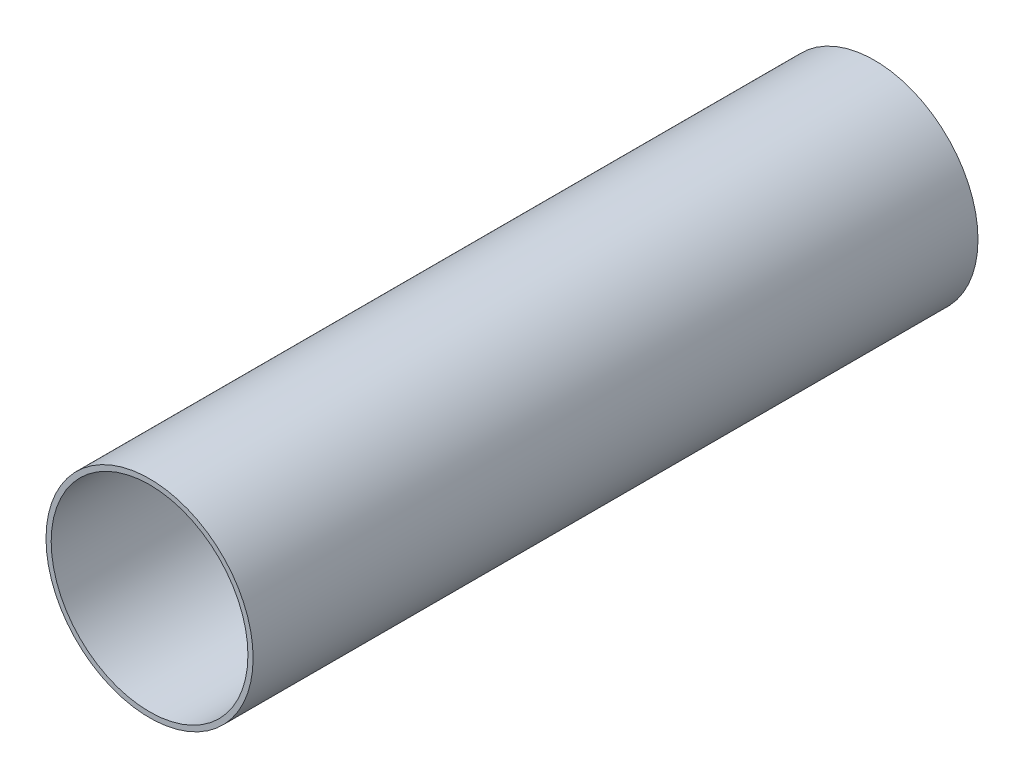
ISO-10303-21;
HEADER;
FILE_DESCRIPTION(('STEP AP214'),'2;1');
FILE_NAME('part.step','',(''),(''),'','','');
FILE_SCHEMA(('AUTOMOTIVE_DESIGN { 1 0 10303 214 1 1 1 1 }'));
ENDSEC;
DATA;
#1=APPLICATION_CONTEXT('core data for automotive mechanical design processes');
#2=APPLICATION_PROTOCOL_DEFINITION('international standard','automotive_design',2000,#1);
#3=PRODUCT_CONTEXT('',#1,'mechanical');
#4=PRODUCT('Part','Part','',(#3));
#5=PRODUCT_RELATED_PRODUCT_CATEGORY('part','',(#4));
#6=PRODUCT_DEFINITION_FORMATION('','',#4);
#7=PRODUCT_DEFINITION_CONTEXT('part definition',#1,'design');
#8=PRODUCT_DEFINITION('design','',#6,#7);
#9=PRODUCT_DEFINITION_SHAPE('','',#8);
#10=(LENGTH_UNIT() NAMED_UNIT(*) SI_UNIT(.MILLI.,.METRE.));
#11=(NAMED_UNIT(*) PLANE_ANGLE_UNIT() SI_UNIT($,.RADIAN.));
#12=(NAMED_UNIT(*) SI_UNIT($,.STERADIAN.) SOLID_ANGLE_UNIT());
#13=UNCERTAINTY_MEASURE_WITH_UNIT(LENGTH_MEASURE(1.E-05),#10,'distance_accuracy_value','');
#14=(GEOMETRIC_REPRESENTATION_CONTEXT(3) GLOBAL_UNCERTAINTY_ASSIGNED_CONTEXT((#13)) GLOBAL_UNIT_ASSIGNED_CONTEXT((#10,
#11,#12)) REPRESENTATION_CONTEXT('',''));
#15=CARTESIAN_POINT('',(0.,0.,0.));
#16=DIRECTION('',(0.,0.,1.));
#17=DIRECTION('',(1.,0.,0.));
#18=AXIS2_PLACEMENT_3D('',#15,#16,#17);
#19=CARTESIAN_POINT('',(0.,0.,70.));
#20=DIRECTION('',(0.,0.,1.));
#21=DIRECTION('',(1.,0.,0.));
#22=AXIS2_PLACEMENT_3D('',#19,#20,#21);
#23=PLANE('',#22);
#24=CARTESIAN_POINT('',(0.,0.,70.));
#25=DIRECTION('',(0.,0.,1.));
#26=DIRECTION('',(1.,0.,0.));
#27=AXIS2_PLACEMENT_3D('',#24,#25,#26);
#28=CIRCLE('',#27,10.);
#29=CARTESIAN_POINT('',(10.,0.,70.));
#30=VERTEX_POINT('',#29);
#31=EDGE_CURVE('E10',#30,#30,#28,.T.);
#32=ORIENTED_EDGE('',*,*,#31,.T.);
#33=EDGE_LOOP('',(#32));
#34=FACE_BOUND('',#33,.T.);
#35=CARTESIAN_POINT('',(0.,0.,70.));
#36=DIRECTION('',(0.,0.,1.));
#37=DIRECTION('',(1.,0.,0.));
#38=AXIS2_PLACEMENT_3D('',#35,#36,#37);
#39=CIRCLE('',#38,9.5);
#40=CARTESIAN_POINT('',(9.5,0.,70.));
#41=VERTEX_POINT('',#40);
#42=EDGE_CURVE('E42',#41,#41,#39,.T.);
#43=ORIENTED_EDGE('',*,*,#42,.F.);
#44=EDGE_LOOP('',(#43));
#45=FACE_BOUND('',#44,.T.);
#46=ADVANCED_FACE('F31',(#34,#45),#23,.T.);
#47=CARTESIAN_POINT('',(0.,0.,0.));
#48=DIRECTION('',(0.,0.,1.));
#49=DIRECTION('',(1.,0.,0.));
#50=AXIS2_PLACEMENT_3D('',#47,#48,#49);
#51=PLANE('',#50);
#52=CARTESIAN_POINT('',(0.,0.,0.));
#53=DIRECTION('',(0.,0.,1.));
#54=DIRECTION('',(1.,0.,0.));
#55=AXIS2_PLACEMENT_3D('',#52,#53,#54);
#56=CIRCLE('',#55,10.);
#57=CARTESIAN_POINT('',(10.,0.,0.));
#58=VERTEX_POINT('',#57);
#59=EDGE_CURVE('E35',#58,#58,#56,.T.);
#60=ORIENTED_EDGE('',*,*,#59,.F.);
#61=EDGE_LOOP('',(#60));
#62=FACE_BOUND('',#61,.T.);
#63=CARTESIAN_POINT('',(0.,0.,0.));
#64=DIRECTION('',(0.,0.,1.));
#65=DIRECTION('',(1.,0.,0.));
#66=AXIS2_PLACEMENT_3D('',#63,#64,#65);
#67=CIRCLE('',#66,9.5);
#68=CARTESIAN_POINT('',(9.5,0.,0.));
#69=VERTEX_POINT('',#68);
#70=EDGE_CURVE('E44',#69,#69,#67,.T.);
#71=ORIENTED_EDGE('',*,*,#70,.T.);
#72=EDGE_LOOP('',(#71));
#73=FACE_BOUND('',#72,.T.);
#74=ADVANCED_FACE('F54',(#62,#73),#51,.F.);
#75=CARTESIAN_POINT('',(0.,0.,70.));
#76=DIRECTION('',(0.,0.,-1.));
#77=DIRECTION('',(-1.,0.,0.));
#78=AXIS2_PLACEMENT_3D('',#75,#76,#77);
#79=CYLINDRICAL_SURFACE('',#78,10.);
#80=ORIENTED_EDGE('',*,*,#31,.F.);
#81=EDGE_LOOP('',(#80));
#82=FACE_BOUND('',#81,.T.);
#83=ORIENTED_EDGE('',*,*,#59,.T.);
#84=EDGE_LOOP('',(#83));
#85=FACE_BOUND('',#84,.T.);
#86=ADVANCED_FACE('F33',(#82,#85),#79,.T.);
#87=CARTESIAN_POINT('',(0.,0.,70.));
#88=DIRECTION('',(0.,0.,-1.));
#89=DIRECTION('',(-1.,0.,0.));
#90=AXIS2_PLACEMENT_3D('',#87,#88,#89);
#91=CYLINDRICAL_SURFACE('',#90,9.5);
#92=ORIENTED_EDGE('',*,*,#42,.T.);
#93=EDGE_LOOP('',(#92));
#94=FACE_BOUND('',#93,.T.);
#95=ORIENTED_EDGE('',*,*,#70,.F.);
#96=EDGE_LOOP('',(#95));
#97=FACE_BOUND('',#96,.T.);
#98=ADVANCED_FACE('F50',(#94,#97),#91,.F.);
#99=CLOSED_SHELL('',(#46,#74,#86,#98));
#100=MANIFOLD_SOLID_BREP('B2',#99);
#101=ADVANCED_BREP_SHAPE_REPRESENTATION('',(#18,#100),#14);
#102=SHAPE_DEFINITION_REPRESENTATION(#9,#101);
ENDSEC;
END-ISO-10303-21;
